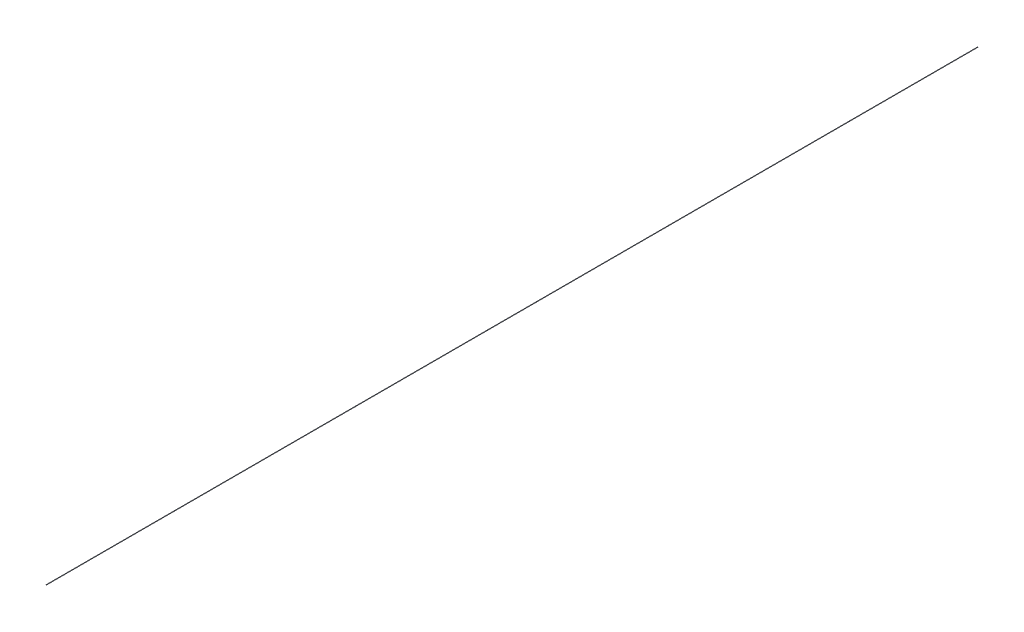
ISO-10303-21;
HEADER;
FILE_DESCRIPTION(('STEP AP214'),'2;1');
FILE_NAME('part.step','',(''),(''),'','','');
FILE_SCHEMA(('AUTOMOTIVE_DESIGN { 1 0 10303 214 1 1 1 1 }'));
ENDSEC;
DATA;
#1=APPLICATION_CONTEXT('core data for automotive mechanical design processes');
#2=APPLICATION_PROTOCOL_DEFINITION('international standard','automotive_design',2000,#1);
#3=PRODUCT_CONTEXT('',#1,'mechanical');
#4=PRODUCT('Part','Part','',(#3));
#5=PRODUCT_RELATED_PRODUCT_CATEGORY('part','',(#4));
#6=PRODUCT_DEFINITION_FORMATION('','',#4);
#7=PRODUCT_DEFINITION_CONTEXT('part definition',#1,'design');
#8=PRODUCT_DEFINITION('design','',#6,#7);
#9=PRODUCT_DEFINITION_SHAPE('','',#8);
#10=(LENGTH_UNIT() NAMED_UNIT(*) SI_UNIT(.MILLI.,.METRE.));
#11=(NAMED_UNIT(*) PLANE_ANGLE_UNIT() SI_UNIT($,.RADIAN.));
#12=(NAMED_UNIT(*) SI_UNIT($,.STERADIAN.) SOLID_ANGLE_UNIT());
#13=UNCERTAINTY_MEASURE_WITH_UNIT(LENGTH_MEASURE(1.E-05),#10,'distance_accuracy_value','');
#14=(GEOMETRIC_REPRESENTATION_CONTEXT(3) GLOBAL_UNCERTAINTY_ASSIGNED_CONTEXT((#13)) GLOBAL_UNIT_ASSIGNED_CONTEXT((#10,
#11,#12)) REPRESENTATION_CONTEXT('',''));
#15=CARTESIAN_POINT('',(0.,0.,0.));
#16=DIRECTION('',(0.,0.,1.));
#17=DIRECTION('',(1.,0.,0.));
#18=AXIS2_PLACEMENT_3D('',#15,#16,#17);
#19=CARTESIAN_POINT('',(0.,0.,1512.5));
#20=DIRECTION('',(0.,0.,-1.));
#21=DIRECTION('',(-1.,0.,0.));
#22=AXIS2_PLACEMENT_3D('',#19,#20,#21);
#23=CYLINDRICAL_SURFACE('',#22,0.5);
#24=CARTESIAN_POINT('',(0.,0.,1512.1));
#25=DIRECTION('',(0.,0.,1.));
#26=DIRECTION('',(1.,0.,0.));
#27=AXIS2_PLACEMENT_3D('',#24,#25,#26);
#28=CIRCLE('',#27,0.5);
#29=CARTESIAN_POINT('',(0.5,0.,1512.1));
#30=VERTEX_POINT('',#29);
#31=EDGE_CURVE('E45',#30,#30,#28,.F.);
#32=ORIENTED_EDGE('',*,*,#31,.T.);
#33=EDGE_LOOP('',(#32));
#34=FACE_BOUND('',#33,.T.);
#35=CARTESIAN_POINT('',(0.,0.,-1512.1));
#36=DIRECTION('',(0.,0.,1.));
#37=DIRECTION('',(1.,0.,0.));
#38=AXIS2_PLACEMENT_3D('',#35,#36,#37);
#39=CIRCLE('',#38,0.5);
#40=CARTESIAN_POINT('',(0.5,0.,-1512.1));
#41=VERTEX_POINT('',#40);
#42=EDGE_CURVE('E50',#41,#41,#39,.T.);
#43=ORIENTED_EDGE('',*,*,#42,.T.);
#44=EDGE_LOOP('',(#43));
#45=FACE_BOUND('',#44,.T.);
#46=ADVANCED_FACE('F37',(#34,#45),#23,.T.);
#47=CARTESIAN_POINT('',(0.,0.,1512.5));
#48=DIRECTION('',(0.,0.,1.));
#49=DIRECTION('',(1.,0.,0.));
#50=AXIS2_PLACEMENT_3D('',#47,#48,#49);
#51=PLANE('',#50);
#52=CARTESIAN_POINT('',(0.,0.,1512.5));
#53=DIRECTION('',(0.,0.,1.));
#54=DIRECTION('',(1.,0.,0.));
#55=AXIS2_PLACEMENT_3D('',#52,#53,#54);
#56=CIRCLE('',#55,0.1);
#57=CARTESIAN_POINT('',(0.1,0.,1512.5));
#58=VERTEX_POINT('',#57);
#59=EDGE_CURVE('E55',#58,#58,#56,.T.);
#60=ORIENTED_EDGE('',*,*,#59,.T.);
#61=EDGE_LOOP('',(#60));
#62=FACE_BOUND('',#61,.T.);
#63=ADVANCED_FACE('F62',(#62),#51,.T.);
#64=CARTESIAN_POINT('',(0.,0.,-1512.5));
#65=DIRECTION('',(0.,0.,1.));
#66=DIRECTION('',(1.,0.,0.));
#67=AXIS2_PLACEMENT_3D('',#64,#65,#66);
#68=PLANE('',#67);
#69=CARTESIAN_POINT('',(0.,0.,-1512.5));
#70=DIRECTION('',(0.,0.,1.));
#71=DIRECTION('',(1.,0.,0.));
#72=AXIS2_PLACEMENT_3D('',#69,#70,#71);
#73=CIRCLE('',#72,0.1);
#74=CARTESIAN_POINT('',(0.1,0.,-1512.5));
#75=VERTEX_POINT('',#74);
#76=EDGE_CURVE('E10',#75,#75,#73,.F.);
#77=ORIENTED_EDGE('',*,*,#76,.T.);
#78=EDGE_LOOP('',(#77));
#79=FACE_BOUND('',#78,.T.);
#80=ADVANCED_FACE('F66',(#79),#68,.F.);
#81=CARTESIAN_POINT('',(0.,0.,1512.1));
#82=DIRECTION('',(0.,0.,1.));
#83=DIRECTION('',(1.,0.,0.));
#84=AXIS2_PLACEMENT_3D('',#81,#82,#83);
#85=DEGENERATE_TOROIDAL_SURFACE('',#84,0.1,0.4,.T.);
#86=ORIENTED_EDGE('',*,*,#31,.F.);
#87=EDGE_LOOP('',(#86));
#88=FACE_BOUND('',#87,.T.);
#89=ORIENTED_EDGE('',*,*,#59,.F.);
#90=EDGE_LOOP('',(#89));
#91=FACE_BOUND('',#90,.T.);
#92=ADVANCED_FACE('F64',(#88,#91),#85,.T.);
#93=CARTESIAN_POINT('',(0.,0.,-1512.1));
#94=DIRECTION('',(0.,0.,1.));
#95=DIRECTION('',(1.,0.,0.));
#96=AXIS2_PLACEMENT_3D('',#93,#94,#95);
#97=DEGENERATE_TOROIDAL_SURFACE('',#96,0.1,0.4,.T.);
#98=ORIENTED_EDGE('',*,*,#76,.F.);
#99=EDGE_LOOP('',(#98));
#100=FACE_BOUND('',#99,.T.);
#101=ORIENTED_EDGE('',*,*,#42,.F.);
#102=EDGE_LOOP('',(#101));
#103=FACE_BOUND('',#102,.T.);
#104=ADVANCED_FACE('F39',(#100,#103),#97,.T.);
#105=CLOSED_SHELL('',(#46,#63,#80,#92,#104));
#106=MANIFOLD_SOLID_BREP('B2',#105);
#107=ADVANCED_BREP_SHAPE_REPRESENTATION('',(#18,#106),#14);
#108=SHAPE_DEFINITION_REPRESENTATION(#9,#107);
ENDSEC;
END-ISO-10303-21;
